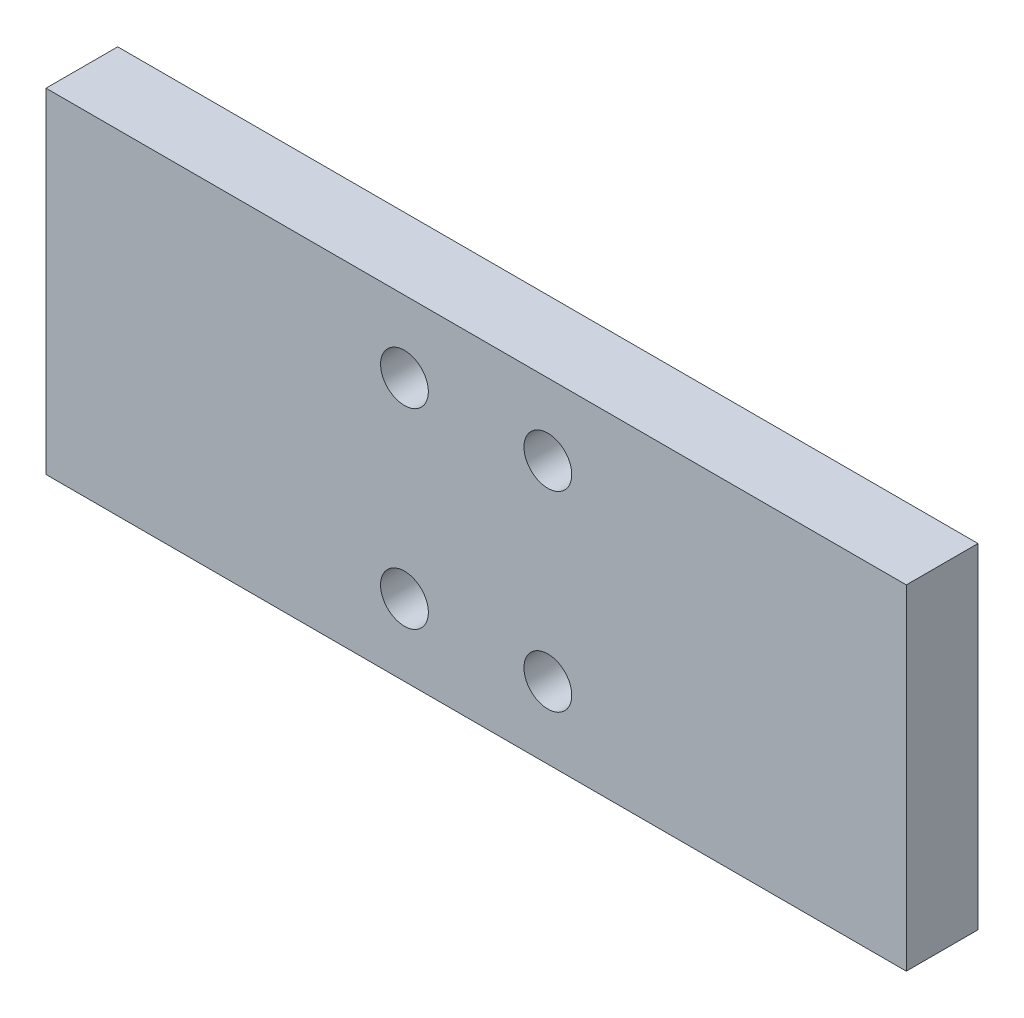
ISO-10303-21;
HEADER;
FILE_DESCRIPTION(('STEP AP214'),'2;1');
FILE_NAME('part.step','',(''),(''),'','','');
FILE_SCHEMA(('AUTOMOTIVE_DESIGN { 1 0 10303 214 1 1 1 1 }'));
ENDSEC;
DATA;
#1=APPLICATION_CONTEXT('core data for automotive mechanical design processes');
#2=APPLICATION_PROTOCOL_DEFINITION('international standard','automotive_design',2000,#1);
#3=PRODUCT_CONTEXT('',#1,'mechanical');
#4=PRODUCT('Part','Part','',(#3));
#5=PRODUCT_RELATED_PRODUCT_CATEGORY('part','',(#4));
#6=PRODUCT_DEFINITION_FORMATION('','',#4);
#7=PRODUCT_DEFINITION_CONTEXT('part definition',#1,'design');
#8=PRODUCT_DEFINITION('design','',#6,#7);
#9=PRODUCT_DEFINITION_SHAPE('','',#8);
#10=(LENGTH_UNIT() NAMED_UNIT(*) SI_UNIT(.MILLI.,.METRE.));
#11=(NAMED_UNIT(*) PLANE_ANGLE_UNIT() SI_UNIT($,.RADIAN.));
#12=(NAMED_UNIT(*) SI_UNIT($,.STERADIAN.) SOLID_ANGLE_UNIT());
#13=UNCERTAINTY_MEASURE_WITH_UNIT(LENGTH_MEASURE(1.E-05),#10,'distance_accuracy_value','');
#14=(GEOMETRIC_REPRESENTATION_CONTEXT(3) GLOBAL_UNCERTAINTY_ASSIGNED_CONTEXT((#13)) GLOBAL_UNIT_ASSIGNED_CONTEXT((#10,
#11,#12)) REPRESENTATION_CONTEXT('',''));
#15=CARTESIAN_POINT('',(0.,0.,0.));
#16=DIRECTION('',(0.,0.,1.));
#17=DIRECTION('',(1.,0.,0.));
#18=AXIS2_PLACEMENT_3D('',#15,#16,#17);
#19=CARTESIAN_POINT('',(0.,0.,7.5));
#20=DIRECTION('',(0.,0.,1.));
#21=DIRECTION('',(1.,0.,0.));
#22=AXIS2_PLACEMENT_3D('',#19,#20,#21);
#23=PLANE('',#22);
#24=CARTESIAN_POINT('',(15.,-20.,7.5));
#25=DIRECTION('',(0.,0.,1.));
#26=DIRECTION('',(1.,0.,0.));
#27=AXIS2_PLACEMENT_3D('',#24,#25,#26);
#28=CIRCLE('',#27,5.);
#29=CARTESIAN_POINT('',(20.,-20.,7.5));
#30=VERTEX_POINT('',#29);
#31=EDGE_CURVE('E123',#30,#30,#28,.T.);
#32=ORIENTED_EDGE('',*,*,#31,.F.);
#33=EDGE_LOOP('',(#32));
#34=FACE_BOUND('',#33,.T.);
#35=CARTESIAN_POINT('',(-15.,20.,7.5));
#36=DIRECTION('',(0.,0.,1.));
#37=DIRECTION('',(1.,0.,0.));
#38=AXIS2_PLACEMENT_3D('',#35,#36,#37);
#39=CIRCLE('',#38,5.);
#40=CARTESIAN_POINT('',(-10.,20.,7.5));
#41=VERTEX_POINT('',#40);
#42=EDGE_CURVE('E102',#41,#41,#39,.T.);
#43=ORIENTED_EDGE('',*,*,#42,.F.);
#44=EDGE_LOOP('',(#43));
#45=FACE_BOUND('',#44,.T.);
#46=DIRECTION('',(0.,1.,0.));
#47=VECTOR('',#46,1.);
#48=CARTESIAN_POINT('',(90.,35.,7.5));
#49=LINE('',#48,#47);
#50=CARTESIAN_POINT('',(90.,-35.,7.5));
#51=VERTEX_POINT('',#50);
#52=CARTESIAN_POINT('',(90.,35.,7.5));
#53=VERTEX_POINT('',#52);
#54=EDGE_CURVE('E87',#51,#53,#49,.T.);
#55=ORIENTED_EDGE('',*,*,#54,.T.);
#56=DIRECTION('',(-1.,0.,0.));
#57=VECTOR('',#56,1.);
#58=CARTESIAN_POINT('',(-90.,35.,7.5));
#59=LINE('',#58,#57);
#60=CARTESIAN_POINT('',(-90.,35.,7.5));
#61=VERTEX_POINT('',#60);
#62=EDGE_CURVE('E82',#53,#61,#59,.T.);
#63=ORIENTED_EDGE('',*,*,#62,.T.);
#64=DIRECTION('',(0.,-1.,0.));
#65=VECTOR('',#64,1.);
#66=CARTESIAN_POINT('',(-90.,35.,7.5));
#67=LINE('',#66,#65);
#68=CARTESIAN_POINT('',(-90.,-35.,7.5));
#69=VERTEX_POINT('',#68);
#70=EDGE_CURVE('E85',#61,#69,#67,.T.);
#71=ORIENTED_EDGE('',*,*,#70,.T.);
#72=DIRECTION('',(1.,0.,0.));
#73=VECTOR('',#72,1.);
#74=CARTESIAN_POINT('',(-90.,-35.,7.5));
#75=LINE('',#74,#73);
#76=EDGE_CURVE('E52',#69,#51,#75,.T.);
#77=ORIENTED_EDGE('',*,*,#76,.T.);
#78=EDGE_LOOP('',(#55,#63,#71,#77));
#79=FACE_BOUND('',#78,.T.);
#80=CARTESIAN_POINT('',(15.,20.,7.5));
#81=DIRECTION('',(0.,0.,1.));
#82=DIRECTION('',(-1.,0.,0.));
#83=AXIS2_PLACEMENT_3D('',#80,#81,#82);
#84=CIRCLE('',#83,5.);
#85=CARTESIAN_POINT('',(9.99999999999996,20.,7.5));
#86=VERTEX_POINT('',#85);
#87=EDGE_CURVE('E117',#86,#86,#84,.T.);
#88=ORIENTED_EDGE('',*,*,#87,.F.);
#89=EDGE_LOOP('',(#88));
#90=FACE_BOUND('',#89,.T.);
#91=CARTESIAN_POINT('',(-15.,-20.,7.5));
#92=DIRECTION('',(0.,0.,1.));
#93=DIRECTION('',(-1.,0.,0.));
#94=AXIS2_PLACEMENT_3D('',#91,#92,#93);
#95=CIRCLE('',#94,5.);
#96=CARTESIAN_POINT('',(-20.,-20.,7.5));
#97=VERTEX_POINT('',#96);
#98=EDGE_CURVE('E129',#97,#97,#95,.T.);
#99=ORIENTED_EDGE('',*,*,#98,.F.);
#100=EDGE_LOOP('',(#99));
#101=FACE_BOUND('',#100,.T.);
#102=ADVANCED_FACE('F35',(#34,#45,#79,#90,#101),#23,.T.);
#103=CARTESIAN_POINT('',(0.,0.,-7.5));
#104=DIRECTION('',(0.,0.,1.));
#105=DIRECTION('',(1.,0.,0.));
#106=AXIS2_PLACEMENT_3D('',#103,#104,#105);
#107=PLANE('',#106);
#108=DIRECTION('',(0.,1.,0.));
#109=VECTOR('',#108,1.);
#110=CARTESIAN_POINT('',(90.,35.,-7.5));
#111=LINE('',#110,#109);
#112=CARTESIAN_POINT('',(90.,-35.,-7.5));
#113=VERTEX_POINT('',#112);
#114=CARTESIAN_POINT('',(90.,35.,-7.5));
#115=VERTEX_POINT('',#114);
#116=EDGE_CURVE('E99',#113,#115,#111,.T.);
#117=ORIENTED_EDGE('',*,*,#116,.F.);
#118=DIRECTION('',(1.,0.,0.));
#119=VECTOR('',#118,1.);
#120=CARTESIAN_POINT('',(-90.,-35.,-7.5));
#121=LINE('',#120,#119);
#122=CARTESIAN_POINT('',(-90.,-35.,-7.5));
#123=VERTEX_POINT('',#122);
#124=EDGE_CURVE('E75',#123,#113,#121,.T.);
#125=ORIENTED_EDGE('',*,*,#124,.F.);
#126=DIRECTION('',(0.,-1.,0.));
#127=VECTOR('',#126,1.);
#128=CARTESIAN_POINT('',(-90.,35.,-7.5));
#129=LINE('',#128,#127);
#130=CARTESIAN_POINT('',(-90.,35.,-7.5));
#131=VERTEX_POINT('',#130);
#132=EDGE_CURVE('E69',#131,#123,#129,.T.);
#133=ORIENTED_EDGE('',*,*,#132,.F.);
#134=DIRECTION('',(-1.,0.,0.));
#135=VECTOR('',#134,1.);
#136=CARTESIAN_POINT('',(-90.,35.,-7.5));
#137=LINE('',#136,#135);
#138=EDGE_CURVE('E91',#115,#131,#137,.T.);
#139=ORIENTED_EDGE('',*,*,#138,.F.);
#140=EDGE_LOOP('',(#117,#125,#133,#139));
#141=FACE_BOUND('',#140,.T.);
#142=CARTESIAN_POINT('',(-15.,20.,-7.5));
#143=DIRECTION('',(0.,0.,1.));
#144=DIRECTION('',(1.,0.,0.));
#145=AXIS2_PLACEMENT_3D('',#142,#143,#144);
#146=CIRCLE('',#145,5.);
#147=CARTESIAN_POINT('',(-10.,20.,-7.5));
#148=VERTEX_POINT('',#147);
#149=EDGE_CURVE('E114',#148,#148,#146,.T.);
#150=ORIENTED_EDGE('',*,*,#149,.T.);
#151=EDGE_LOOP('',(#150));
#152=FACE_BOUND('',#151,.T.);
#153=CARTESIAN_POINT('',(15.,20.,-7.5));
#154=DIRECTION('',(0.,0.,1.));
#155=DIRECTION('',(-1.,0.,0.));
#156=AXIS2_PLACEMENT_3D('',#153,#154,#155);
#157=CIRCLE('',#156,5.);
#158=CARTESIAN_POINT('',(9.99999999999996,20.,-7.5));
#159=VERTEX_POINT('',#158);
#160=EDGE_CURVE('E120',#159,#159,#157,.T.);
#161=ORIENTED_EDGE('',*,*,#160,.T.);
#162=EDGE_LOOP('',(#161));
#163=FACE_BOUND('',#162,.T.);
#164=CARTESIAN_POINT('',(15.,-20.,-7.5));
#165=DIRECTION('',(0.,0.,1.));
#166=DIRECTION('',(1.,0.,0.));
#167=AXIS2_PLACEMENT_3D('',#164,#165,#166);
#168=CIRCLE('',#167,5.);
#169=CARTESIAN_POINT('',(20.,-20.,-7.5));
#170=VERTEX_POINT('',#169);
#171=EDGE_CURVE('E126',#170,#170,#168,.T.);
#172=ORIENTED_EDGE('',*,*,#171,.T.);
#173=EDGE_LOOP('',(#172));
#174=FACE_BOUND('',#173,.T.);
#175=CARTESIAN_POINT('',(-15.,-20.,-7.5));
#176=DIRECTION('',(0.,0.,1.));
#177=DIRECTION('',(-1.,0.,0.));
#178=AXIS2_PLACEMENT_3D('',#175,#176,#177);
#179=CIRCLE('',#178,5.);
#180=CARTESIAN_POINT('',(-20.,-20.,-7.5));
#181=VERTEX_POINT('',#180);
#182=EDGE_CURVE('E132',#181,#181,#179,.T.);
#183=ORIENTED_EDGE('',*,*,#182,.T.);
#184=EDGE_LOOP('',(#183));
#185=FACE_BOUND('',#184,.T.);
#186=ADVANCED_FACE('F110',(#141,#152,#163,#174,#185),#107,.F.);
#187=CARTESIAN_POINT('',(90.,35.,7.5));
#188=DIRECTION('',(-1.,0.,0.));
#189=DIRECTION('',(0.,0.,1.));
#190=AXIS2_PLACEMENT_3D('',#187,#188,#189);
#191=PLANE('',#190);
#192=ORIENTED_EDGE('',*,*,#116,.T.);
#193=DIRECTION('',(0.,0.,-1.));
#194=VECTOR('',#193,1.);
#195=CARTESIAN_POINT('',(90.,35.,7.5));
#196=LINE('',#195,#194);
#197=EDGE_CURVE('E11',#53,#115,#196,.T.);
#198=ORIENTED_EDGE('',*,*,#197,.F.);
#199=ORIENTED_EDGE('',*,*,#54,.F.);
#200=DIRECTION('',(0.,0.,-1.));
#201=VECTOR('',#200,1.);
#202=CARTESIAN_POINT('',(90.,-35.,7.5));
#203=LINE('',#202,#201);
#204=EDGE_CURVE('E95',#51,#113,#203,.T.);
#205=ORIENTED_EDGE('',*,*,#204,.T.);
#206=EDGE_LOOP('',(#192,#198,#199,#205));
#207=FACE_BOUND('',#206,.T.);
#208=ADVANCED_FACE('F37',(#207),#191,.F.);
#209=CARTESIAN_POINT('',(-90.,35.,7.5));
#210=DIRECTION('',(0.,-1.,0.));
#211=DIRECTION('',(1.,0.,0.));
#212=AXIS2_PLACEMENT_3D('',#209,#210,#211);
#213=PLANE('',#212);
#214=ORIENTED_EDGE('',*,*,#138,.T.);
#215=DIRECTION('',(0.,0.,-1.));
#216=VECTOR('',#215,1.);
#217=CARTESIAN_POINT('',(-90.,35.,7.5));
#218=LINE('',#217,#216);
#219=EDGE_CURVE('E44',#61,#131,#218,.T.);
#220=ORIENTED_EDGE('',*,*,#219,.F.);
#221=ORIENTED_EDGE('',*,*,#62,.F.);
#222=ORIENTED_EDGE('',*,*,#197,.T.);
#223=EDGE_LOOP('',(#214,#220,#221,#222));
#224=FACE_BOUND('',#223,.T.);
#225=ADVANCED_FACE('F90',(#224),#213,.F.);
#226=CARTESIAN_POINT('',(-90.,35.,7.5));
#227=DIRECTION('',(1.,0.,0.));
#228=DIRECTION('',(0.,0.,-1.));
#229=AXIS2_PLACEMENT_3D('',#226,#227,#228);
#230=PLANE('',#229);
#231=ORIENTED_EDGE('',*,*,#132,.T.);
#232=DIRECTION('',(0.,0.,-1.));
#233=VECTOR('',#232,1.);
#234=CARTESIAN_POINT('',(-90.,-35.,7.5));
#235=LINE('',#234,#233);
#236=EDGE_CURVE('E92',#69,#123,#235,.T.);
#237=ORIENTED_EDGE('',*,*,#236,.F.);
#238=ORIENTED_EDGE('',*,*,#70,.F.);
#239=ORIENTED_EDGE('',*,*,#219,.T.);
#240=EDGE_LOOP('',(#231,#237,#238,#239));
#241=FACE_BOUND('',#240,.T.);
#242=ADVANCED_FACE('F93',(#241),#230,.F.);
#243=CARTESIAN_POINT('',(-90.,-35.,7.5));
#244=DIRECTION('',(0.,1.,0.));
#245=DIRECTION('',(0.,0.,1.));
#246=AXIS2_PLACEMENT_3D('',#243,#244,#245);
#247=PLANE('',#246);
#248=ORIENTED_EDGE('',*,*,#124,.T.);
#249=ORIENTED_EDGE('',*,*,#204,.F.);
#250=ORIENTED_EDGE('',*,*,#76,.F.);
#251=ORIENTED_EDGE('',*,*,#236,.T.);
#252=EDGE_LOOP('',(#248,#249,#250,#251));
#253=FACE_BOUND('',#252,.T.);
#254=ADVANCED_FACE('F107',(#253),#247,.F.);
#255=CARTESIAN_POINT('',(-15.,20.,7.5));
#256=DIRECTION('',(0.,0.,-1.));
#257=DIRECTION('',(-1.,0.,0.));
#258=AXIS2_PLACEMENT_3D('',#255,#256,#257);
#259=CYLINDRICAL_SURFACE('',#258,5.);
#260=ORIENTED_EDGE('',*,*,#42,.T.);
#261=EDGE_LOOP('',(#260));
#262=FACE_BOUND('',#261,.T.);
#263=ORIENTED_EDGE('',*,*,#149,.F.);
#264=EDGE_LOOP('',(#263));
#265=FACE_BOUND('',#264,.T.);
#266=ADVANCED_FACE('F151',(#262,#265),#259,.F.);
#267=CARTESIAN_POINT('',(15.,20.,7.5));
#268=DIRECTION('',(0.,0.,-1.));
#269=DIRECTION('',(-1.,0.,0.));
#270=AXIS2_PLACEMENT_3D('',#267,#268,#269);
#271=CYLINDRICAL_SURFACE('',#270,5.);
#272=ORIENTED_EDGE('',*,*,#87,.T.);
#273=EDGE_LOOP('',(#272));
#274=FACE_BOUND('',#273,.T.);
#275=ORIENTED_EDGE('',*,*,#160,.F.);
#276=EDGE_LOOP('',(#275));
#277=FACE_BOUND('',#276,.T.);
#278=ADVANCED_FACE('F197',(#274,#277),#271,.F.);
#279=CARTESIAN_POINT('',(15.,-20.,7.5));
#280=DIRECTION('',(0.,0.,-1.));
#281=DIRECTION('',(-1.,0.,0.));
#282=AXIS2_PLACEMENT_3D('',#279,#280,#281);
#283=CYLINDRICAL_SURFACE('',#282,5.);
#284=ORIENTED_EDGE('',*,*,#31,.T.);
#285=EDGE_LOOP('',(#284));
#286=FACE_BOUND('',#285,.T.);
#287=ORIENTED_EDGE('',*,*,#171,.F.);
#288=EDGE_LOOP('',(#287));
#289=FACE_BOUND('',#288,.T.);
#290=ADVANCED_FACE('F205',(#286,#289),#283,.F.);
#291=CARTESIAN_POINT('',(-15.,-20.,7.5));
#292=DIRECTION('',(0.,0.,-1.));
#293=DIRECTION('',(-1.,0.,0.));
#294=AXIS2_PLACEMENT_3D('',#291,#292,#293);
#295=CYLINDRICAL_SURFACE('',#294,5.);
#296=ORIENTED_EDGE('',*,*,#98,.T.);
#297=EDGE_LOOP('',(#296));
#298=FACE_BOUND('',#297,.T.);
#299=ORIENTED_EDGE('',*,*,#182,.F.);
#300=EDGE_LOOP('',(#299));
#301=FACE_BOUND('',#300,.T.);
#302=ADVANCED_FACE('F138',(#298,#301),#295,.F.);
#303=CLOSED_SHELL('',(#102,#186,#208,#225,#242,#254,#266,#278,#290,#302));
#304=MANIFOLD_SOLID_BREP('B2',#303);
#305=ADVANCED_BREP_SHAPE_REPRESENTATION('',(#18,#304),#14);
#306=SHAPE_DEFINITION_REPRESENTATION(#9,#305);
ENDSEC;
END-ISO-10303-21;
